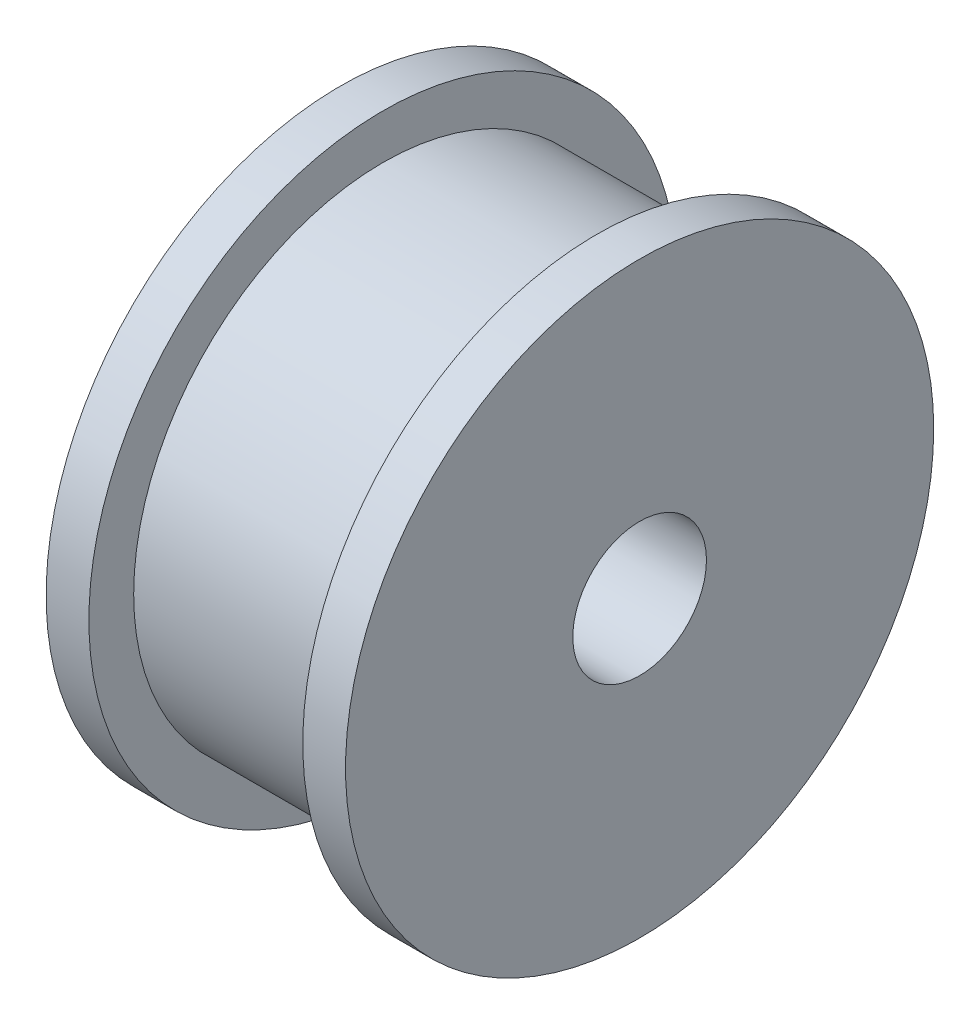
ISO-10303-21;
HEADER;
FILE_DESCRIPTION(('STEP AP214'),'2;1');
FILE_NAME('part.step','',(''),(''),'','','');
FILE_SCHEMA(('AUTOMOTIVE_DESIGN { 1 0 10303 214 1 1 1 1 }'));
ENDSEC;
DATA;
#1=APPLICATION_CONTEXT('core data for automotive mechanical design processes');
#2=APPLICATION_PROTOCOL_DEFINITION('international standard','automotive_design',2000,#1);
#3=PRODUCT_CONTEXT('',#1,'mechanical');
#4=PRODUCT('Part','Part','',(#3));
#5=PRODUCT_RELATED_PRODUCT_CATEGORY('part','',(#4));
#6=PRODUCT_DEFINITION_FORMATION('','',#4);
#7=PRODUCT_DEFINITION_CONTEXT('part definition',#1,'design');
#8=PRODUCT_DEFINITION('design','',#6,#7);
#9=PRODUCT_DEFINITION_SHAPE('','',#8);
#10=(LENGTH_UNIT() NAMED_UNIT(*) SI_UNIT(.MILLI.,.METRE.));
#11=(NAMED_UNIT(*) PLANE_ANGLE_UNIT() SI_UNIT($,.RADIAN.));
#12=(NAMED_UNIT(*) SI_UNIT($,.STERADIAN.) SOLID_ANGLE_UNIT());
#13=UNCERTAINTY_MEASURE_WITH_UNIT(LENGTH_MEASURE(1.E-05),#10,'distance_accuracy_value','');
#14=(GEOMETRIC_REPRESENTATION_CONTEXT(3) GLOBAL_UNCERTAINTY_ASSIGNED_CONTEXT((#13)) GLOBAL_UNIT_ASSIGNED_CONTEXT((#10,
#11,#12)) REPRESENTATION_CONTEXT('',''));
#15=CARTESIAN_POINT('',(0.,0.,0.));
#16=DIRECTION('',(0.,0.,1.));
#17=DIRECTION('',(1.,0.,0.));
#18=AXIS2_PLACEMENT_3D('',#15,#16,#17);
#19=CARTESIAN_POINT('',(-4.,11.,0.));
#20=DIRECTION('',(1.,0.,0.));
#21=DIRECTION('',(0.,0.,-1.));
#22=AXIS2_PLACEMENT_3D('',#19,#20,#21);
#23=PLANE('',#22);
#24=CARTESIAN_POINT('',(-4.,0.,0.));
#25=DIRECTION('',(1.,0.,0.));
#26=DIRECTION('',(0.,0.,-1.));
#27=AXIS2_PLACEMENT_3D('',#24,#25,#26);
#28=CIRCLE('',#27,11.);
#29=CARTESIAN_POINT('',(-4.,0.,-11.));
#30=VERTEX_POINT('',#29);
#31=EDGE_CURVE('E10',#30,#30,#28,.T.);
#32=ORIENTED_EDGE('',*,*,#31,.T.);
#33=EDGE_LOOP('',(#32));
#34=FACE_BOUND('',#33,.T.);
#35=CARTESIAN_POINT('',(-4.,0.,0.));
#36=DIRECTION('',(1.,0.,0.));
#37=DIRECTION('',(0.,0.,-1.));
#38=AXIS2_PLACEMENT_3D('',#35,#36,#37);
#39=CIRCLE('',#38,9.325);
#40=CARTESIAN_POINT('',(-4.,0.,-9.325));
#41=VERTEX_POINT('',#40);
#42=EDGE_CURVE('E59',#41,#41,#39,.T.);
#43=ORIENTED_EDGE('',*,*,#42,.F.);
#44=EDGE_LOOP('',(#43));
#45=FACE_BOUND('',#44,.T.);
#46=ADVANCED_FACE('F31',(#34,#45),#23,.T.);
#47=CARTESIAN_POINT('',(0.,0.,0.));
#48=DIRECTION('',(1.,0.,0.));
#49=DIRECTION('',(0.,0.,-1.));
#50=AXIS2_PLACEMENT_3D('',#47,#48,#49);
#51=CYLINDRICAL_SURFACE('',#50,11.);
#52=CARTESIAN_POINT('',(-5.6,0.,0.));
#53=DIRECTION('',(1.,0.,0.));
#54=DIRECTION('',(0.,0.,-1.));
#55=AXIS2_PLACEMENT_3D('',#52,#53,#54);
#56=CIRCLE('',#55,11.);
#57=CARTESIAN_POINT('',(-5.6,0.,-11.));
#58=VERTEX_POINT('',#57);
#59=EDGE_CURVE('E37',#58,#58,#56,.T.);
#60=ORIENTED_EDGE('',*,*,#59,.T.);
#61=EDGE_LOOP('',(#60));
#62=FACE_BOUND('',#61,.T.);
#63=ORIENTED_EDGE('',*,*,#31,.F.);
#64=EDGE_LOOP('',(#63));
#65=FACE_BOUND('',#64,.T.);
#66=ADVANCED_FACE('F67',(#62,#65),#51,.T.);
#67=CARTESIAN_POINT('',(-5.6,11.,0.));
#68=DIRECTION('',(-1.,0.,0.));
#69=DIRECTION('',(0.,0.,1.));
#70=AXIS2_PLACEMENT_3D('',#67,#68,#69);
#71=PLANE('',#70);
#72=CARTESIAN_POINT('',(-5.6,0.,0.));
#73=DIRECTION('',(1.,0.,0.));
#74=DIRECTION('',(0.,0.,-1.));
#75=AXIS2_PLACEMENT_3D('',#72,#73,#74);
#76=CIRCLE('',#75,2.5);
#77=CARTESIAN_POINT('',(-5.6,0.,-2.5));
#78=VERTEX_POINT('',#77);
#79=EDGE_CURVE('E41',#78,#78,#76,.T.);
#80=ORIENTED_EDGE('',*,*,#79,.T.);
#81=EDGE_LOOP('',(#80));
#82=FACE_BOUND('',#81,.T.);
#83=ORIENTED_EDGE('',*,*,#59,.F.);
#84=EDGE_LOOP('',(#83));
#85=FACE_BOUND('',#84,.T.);
#86=ADVANCED_FACE('F71',(#82,#85),#71,.T.);
#87=CARTESIAN_POINT('',(0.,0.,0.));
#88=DIRECTION('',(1.,0.,0.));
#89=DIRECTION('',(0.,0.,-1.));
#90=AXIS2_PLACEMENT_3D('',#87,#88,#89);
#91=CYLINDRICAL_SURFACE('',#90,2.5);
#92=CARTESIAN_POINT('',(5.6,0.,0.));
#93=DIRECTION('',(1.,0.,0.));
#94=DIRECTION('',(0.,0.,-1.));
#95=AXIS2_PLACEMENT_3D('',#92,#93,#94);
#96=CIRCLE('',#95,2.5);
#97=CARTESIAN_POINT('',(5.6,0.,-2.5));
#98=VERTEX_POINT('',#97);
#99=EDGE_CURVE('E45',#98,#98,#96,.T.);
#100=ORIENTED_EDGE('',*,*,#99,.T.);
#101=EDGE_LOOP('',(#100));
#102=FACE_BOUND('',#101,.T.);
#103=ORIENTED_EDGE('',*,*,#79,.F.);
#104=EDGE_LOOP('',(#103));
#105=FACE_BOUND('',#104,.T.);
#106=ADVANCED_FACE('F75',(#102,#105),#91,.F.);
#107=CARTESIAN_POINT('',(5.6,11.,0.));
#108=DIRECTION('',(1.,0.,0.));
#109=DIRECTION('',(0.,0.,-1.));
#110=AXIS2_PLACEMENT_3D('',#107,#108,#109);
#111=PLANE('',#110);
#112=CARTESIAN_POINT('',(5.6,0.,0.));
#113=DIRECTION('',(1.,0.,0.));
#114=DIRECTION('',(0.,0.,-1.));
#115=AXIS2_PLACEMENT_3D('',#112,#113,#114);
#116=CIRCLE('',#115,11.);
#117=CARTESIAN_POINT('',(5.6,0.,-11.));
#118=VERTEX_POINT('',#117);
#119=EDGE_CURVE('E50',#118,#118,#116,.T.);
#120=ORIENTED_EDGE('',*,*,#119,.T.);
#121=EDGE_LOOP('',(#120));
#122=FACE_BOUND('',#121,.T.);
#123=ORIENTED_EDGE('',*,*,#99,.F.);
#124=EDGE_LOOP('',(#123));
#125=FACE_BOUND('',#124,.T.);
#126=ADVANCED_FACE('F82',(#122,#125),#111,.T.);
#127=CARTESIAN_POINT('',(0.,0.,0.));
#128=DIRECTION('',(1.,0.,0.));
#129=DIRECTION('',(0.,0.,-1.));
#130=AXIS2_PLACEMENT_3D('',#127,#128,#129);
#131=CYLINDRICAL_SURFACE('',#130,11.);
#132=CARTESIAN_POINT('',(4.,0.,0.));
#133=DIRECTION('',(1.,0.,0.));
#134=DIRECTION('',(0.,0.,-1.));
#135=AXIS2_PLACEMENT_3D('',#132,#133,#134);
#136=CIRCLE('',#135,11.);
#137=CARTESIAN_POINT('',(4.,0.,-11.));
#138=VERTEX_POINT('',#137);
#139=EDGE_CURVE('E53',#138,#138,#136,.T.);
#140=ORIENTED_EDGE('',*,*,#139,.T.);
#141=EDGE_LOOP('',(#140));
#142=FACE_BOUND('',#141,.T.);
#143=ORIENTED_EDGE('',*,*,#119,.F.);
#144=EDGE_LOOP('',(#143));
#145=FACE_BOUND('',#144,.T.);
#146=ADVANCED_FACE('F86',(#142,#145),#131,.T.);
#147=CARTESIAN_POINT('',(4.,9.325,0.));
#148=DIRECTION('',(-1.,0.,0.));
#149=DIRECTION('',(0.,0.,1.));
#150=AXIS2_PLACEMENT_3D('',#147,#148,#149);
#151=PLANE('',#150);
#152=CARTESIAN_POINT('',(4.,0.,0.));
#153=DIRECTION('',(1.,0.,0.));
#154=DIRECTION('',(0.,0.,-1.));
#155=AXIS2_PLACEMENT_3D('',#152,#153,#154);
#156=CIRCLE('',#155,9.325);
#157=CARTESIAN_POINT('',(4.,0.,-9.325));
#158=VERTEX_POINT('',#157);
#159=EDGE_CURVE('E56',#158,#158,#156,.T.);
#160=ORIENTED_EDGE('',*,*,#159,.T.);
#161=EDGE_LOOP('',(#160));
#162=FACE_BOUND('',#161,.T.);
#163=ORIENTED_EDGE('',*,*,#139,.F.);
#164=EDGE_LOOP('',(#163));
#165=FACE_BOUND('',#164,.T.);
#166=ADVANCED_FACE('F90',(#162,#165),#151,.T.);
#167=CARTESIAN_POINT('',(0.,0.,0.));
#168=DIRECTION('',(1.,0.,0.));
#169=DIRECTION('',(0.,0.,-1.));
#170=AXIS2_PLACEMENT_3D('',#167,#168,#169);
#171=CYLINDRICAL_SURFACE('',#170,9.325);
#172=ORIENTED_EDGE('',*,*,#42,.T.);
#173=EDGE_LOOP('',(#172));
#174=FACE_BOUND('',#173,.T.);
#175=ORIENTED_EDGE('',*,*,#159,.F.);
#176=EDGE_LOOP('',(#175));
#177=FACE_BOUND('',#176,.T.);
#178=ADVANCED_FACE('F63',(#174,#177),#171,.T.);
#179=CLOSED_SHELL('',(#46,#66,#86,#106,#126,#146,#166,#178));
#180=MANIFOLD_SOLID_BREP('B2',#179);
#181=ADVANCED_BREP_SHAPE_REPRESENTATION('',(#18,#180),#14);
#182=SHAPE_DEFINITION_REPRESENTATION(#9,#181);
ENDSEC;
END-ISO-10303-21;
